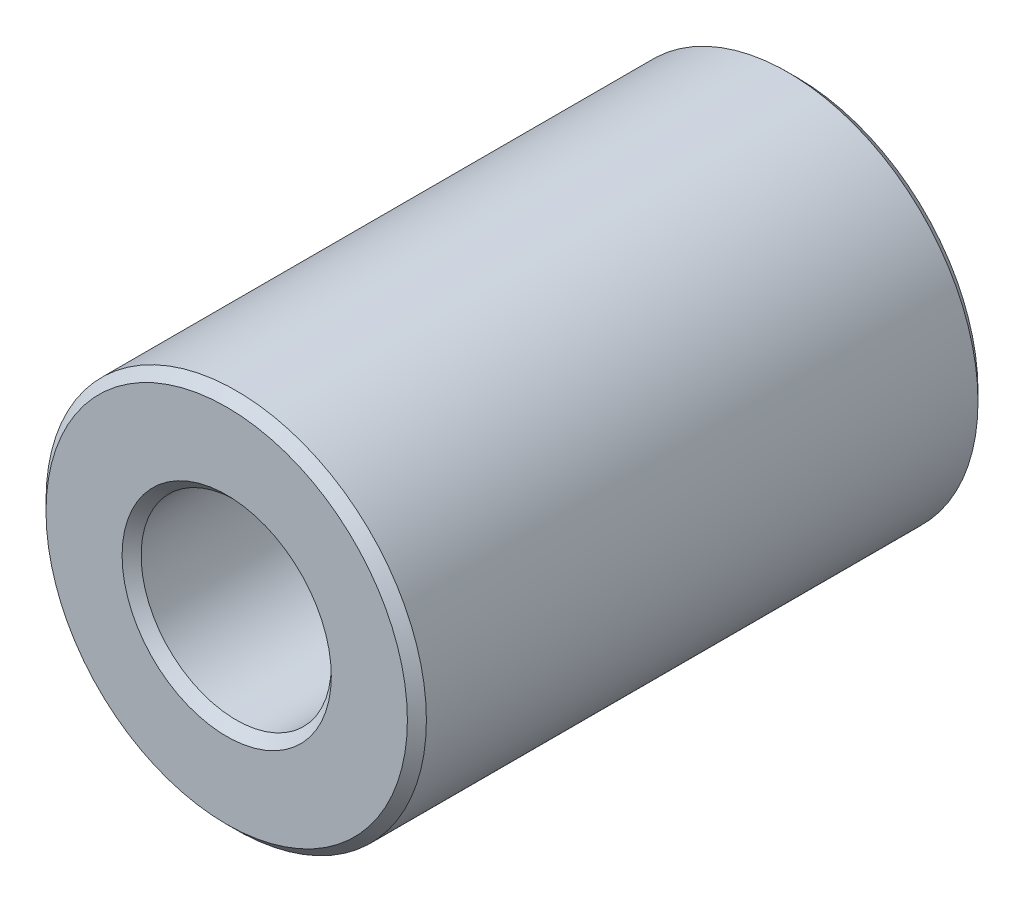
ISO-10303-21;
HEADER;
FILE_DESCRIPTION(('STEP AP214'),'2;1');
FILE_NAME('part.step','',(''),(''),'','','');
FILE_SCHEMA(('AUTOMOTIVE_DESIGN { 1 0 10303 214 1 1 1 1 }'));
ENDSEC;
DATA;
#1=APPLICATION_CONTEXT('core data for automotive mechanical design processes');
#2=APPLICATION_PROTOCOL_DEFINITION('international standard','automotive_design',2000,#1);
#3=PRODUCT_CONTEXT('',#1,'mechanical');
#4=PRODUCT('Part','Part','',(#3));
#5=PRODUCT_RELATED_PRODUCT_CATEGORY('part','',(#4));
#6=PRODUCT_DEFINITION_FORMATION('','',#4);
#7=PRODUCT_DEFINITION_CONTEXT('part definition',#1,'design');
#8=PRODUCT_DEFINITION('design','',#6,#7);
#9=PRODUCT_DEFINITION_SHAPE('','',#8);
#10=(LENGTH_UNIT() NAMED_UNIT(*) SI_UNIT(.MILLI.,.METRE.));
#11=(NAMED_UNIT(*) PLANE_ANGLE_UNIT() SI_UNIT($,.RADIAN.));
#12=(NAMED_UNIT(*) SI_UNIT($,.STERADIAN.) SOLID_ANGLE_UNIT());
#13=UNCERTAINTY_MEASURE_WITH_UNIT(LENGTH_MEASURE(1.E-05),#10,'distance_accuracy_value','');
#14=(GEOMETRIC_REPRESENTATION_CONTEXT(3) GLOBAL_UNCERTAINTY_ASSIGNED_CONTEXT((#13)) GLOBAL_UNIT_ASSIGNED_CONTEXT((#10,
#11,#12)) REPRESENTATION_CONTEXT('',''));
#15=CARTESIAN_POINT('',(0.,0.,0.));
#16=DIRECTION('',(0.,0.,1.));
#17=DIRECTION('',(1.,0.,0.));
#18=AXIS2_PLACEMENT_3D('',#15,#16,#17);
#19=CARTESIAN_POINT('',(0.,0.,6.));
#20=DIRECTION('',(0.,0.,1.));
#21=DIRECTION('',(1.,0.,0.));
#22=AXIS2_PLACEMENT_3D('',#19,#20,#21);
#23=PLANE('',#22);
#24=CARTESIAN_POINT('',(0.,0.,6.));
#25=DIRECTION('',(0.,0.,1.));
#26=DIRECTION('',(1.,0.,0.));
#27=AXIS2_PLACEMENT_3D('',#24,#25,#26);
#28=CIRCLE('',#27,2.2);
#29=CARTESIAN_POINT('',(2.2,0.,6.));
#30=VERTEX_POINT('',#29);
#31=EDGE_CURVE('E54',#30,#30,#28,.F.);
#32=ORIENTED_EDGE('',*,*,#31,.T.);
#33=EDGE_LOOP('',(#32));
#34=FACE_BOUND('',#33,.T.);
#35=CARTESIAN_POINT('',(0.,0.,6.));
#36=DIRECTION('',(0.,0.,1.));
#37=DIRECTION('',(1.,0.,0.));
#38=AXIS2_PLACEMENT_3D('',#35,#36,#37);
#39=CIRCLE('',#38,3.8);
#40=CARTESIAN_POINT('',(3.8,0.,6.));
#41=VERTEX_POINT('',#40);
#42=EDGE_CURVE('E57',#41,#41,#39,.T.);
#43=ORIENTED_EDGE('',*,*,#42,.T.);
#44=EDGE_LOOP('',(#43));
#45=FACE_BOUND('',#44,.T.);
#46=ADVANCED_FACE('F33',(#34,#45),#23,.T.);
#47=CARTESIAN_POINT('',(0.,0.,-6.));
#48=DIRECTION('',(0.,0.,1.));
#49=DIRECTION('',(1.,0.,0.));
#50=AXIS2_PLACEMENT_3D('',#47,#48,#49);
#51=PLANE('',#50);
#52=CARTESIAN_POINT('',(0.,0.,-6.));
#53=DIRECTION('',(0.,0.,1.));
#54=DIRECTION('',(1.,0.,0.));
#55=AXIS2_PLACEMENT_3D('',#52,#53,#54);
#56=CIRCLE('',#55,2.2);
#57=CARTESIAN_POINT('',(2.2,0.,-6.));
#58=VERTEX_POINT('',#57);
#59=EDGE_CURVE('E45',#58,#58,#56,.T.);
#60=ORIENTED_EDGE('',*,*,#59,.T.);
#61=EDGE_LOOP('',(#60));
#62=FACE_BOUND('',#61,.T.);
#63=CARTESIAN_POINT('',(0.,0.,-6.));
#64=DIRECTION('',(0.,0.,1.));
#65=DIRECTION('',(1.,0.,0.));
#66=AXIS2_PLACEMENT_3D('',#63,#64,#65);
#67=CIRCLE('',#66,3.8);
#68=CARTESIAN_POINT('',(3.8,0.,-6.));
#69=VERTEX_POINT('',#68);
#70=EDGE_CURVE('E49',#69,#69,#67,.F.);
#71=ORIENTED_EDGE('',*,*,#70,.T.);
#72=EDGE_LOOP('',(#71));
#73=FACE_BOUND('',#72,.T.);
#74=ADVANCED_FACE('F77',(#62,#73),#51,.F.);
#75=CARTESIAN_POINT('',(0.,0.,6.));
#76=DIRECTION('',(0.,0.,-1.));
#77=DIRECTION('',(-1.,0.,0.));
#78=AXIS2_PLACEMENT_3D('',#75,#76,#77);
#79=CYLINDRICAL_SURFACE('',#78,4.);
#80=CARTESIAN_POINT('',(0.,0.,-5.8));
#81=DIRECTION('',(0.,0.,1.));
#82=DIRECTION('',(1.,0.,0.));
#83=AXIS2_PLACEMENT_3D('',#80,#81,#82);
#84=CIRCLE('',#83,4.);
#85=CARTESIAN_POINT('',(4.,0.,-5.8));
#86=VERTEX_POINT('',#85);
#87=EDGE_CURVE('E10',#86,#86,#84,.T.);
#88=ORIENTED_EDGE('',*,*,#87,.T.);
#89=EDGE_LOOP('',(#88));
#90=FACE_BOUND('',#89,.T.);
#91=CARTESIAN_POINT('',(0.,0.,5.8));
#92=DIRECTION('',(0.,0.,1.));
#93=DIRECTION('',(1.,0.,0.));
#94=AXIS2_PLACEMENT_3D('',#91,#92,#93);
#95=CIRCLE('',#94,4.);
#96=CARTESIAN_POINT('',(4.,0.,5.8));
#97=VERTEX_POINT('',#96);
#98=EDGE_CURVE('E41',#97,#97,#95,.F.);
#99=ORIENTED_EDGE('',*,*,#98,.T.);
#100=EDGE_LOOP('',(#99));
#101=FACE_BOUND('',#100,.T.);
#102=ADVANCED_FACE('F80',(#90,#101),#79,.T.);
#103=CARTESIAN_POINT('',(0.,0.,6.));
#104=DIRECTION('',(0.,0.,-1.));
#105=DIRECTION('',(-1.,0.,0.));
#106=AXIS2_PLACEMENT_3D('',#103,#104,#105);
#107=CYLINDRICAL_SURFACE('',#106,2.);
#108=CARTESIAN_POINT('',(0.,0.,5.8));
#109=DIRECTION('',(0.,0.,1.));
#110=DIRECTION('',(1.,0.,0.));
#111=AXIS2_PLACEMENT_3D('',#108,#109,#110);
#112=CIRCLE('',#111,2.);
#113=CARTESIAN_POINT('',(2.,0.,5.8));
#114=VERTEX_POINT('',#113);
#115=EDGE_CURVE('E60',#114,#114,#112,.T.);
#116=ORIENTED_EDGE('',*,*,#115,.T.);
#117=EDGE_LOOP('',(#116));
#118=FACE_BOUND('',#117,.T.);
#119=CARTESIAN_POINT('',(0.,0.,-5.8));
#120=DIRECTION('',(0.,0.,1.));
#121=DIRECTION('',(1.,0.,0.));
#122=AXIS2_PLACEMENT_3D('',#119,#120,#121);
#123=CIRCLE('',#122,2.);
#124=CARTESIAN_POINT('',(2.,0.,-5.8));
#125=VERTEX_POINT('',#124);
#126=EDGE_CURVE('E63',#125,#125,#123,.F.);
#127=ORIENTED_EDGE('',*,*,#126,.T.);
#128=EDGE_LOOP('',(#127));
#129=FACE_BOUND('',#128,.T.);
#130=ADVANCED_FACE('F67',(#118,#129),#107,.F.);
#131=CARTESIAN_POINT('',(0.,0.,5.8));
#132=DIRECTION('',(0.,0.,1.));
#133=DIRECTION('',(1.,0.,0.));
#134=AXIS2_PLACEMENT_3D('',#131,#132,#133);
#135=CONICAL_SURFACE('',#134,2.,0.785398163397448);
#136=ORIENTED_EDGE('',*,*,#31,.F.);
#137=EDGE_LOOP('',(#136));
#138=FACE_BOUND('',#137,.T.);
#139=ORIENTED_EDGE('',*,*,#115,.F.);
#140=EDGE_LOOP('',(#139));
#141=FACE_BOUND('',#140,.T.);
#142=ADVANCED_FACE('F73',(#138,#141),#135,.F.);
#143=CARTESIAN_POINT('',(0.,0.,-6.));
#144=DIRECTION('',(0.,0.,-1.));
#145=DIRECTION('',(-1.,0.,0.));
#146=AXIS2_PLACEMENT_3D('',#143,#144,#145);
#147=CONICAL_SURFACE('',#146,2.2,0.785398163397448);
#148=ORIENTED_EDGE('',*,*,#126,.F.);
#149=EDGE_LOOP('',(#148));
#150=FACE_BOUND('',#149,.T.);
#151=ORIENTED_EDGE('',*,*,#59,.F.);
#152=EDGE_LOOP('',(#151));
#153=FACE_BOUND('',#152,.T.);
#154=ADVANCED_FACE('F69',(#150,#153),#147,.F.);
#155=CARTESIAN_POINT('',(0.,0.,-5.8));
#156=DIRECTION('',(0.,0.,1.));
#157=DIRECTION('',(1.,0.,0.));
#158=AXIS2_PLACEMENT_3D('',#155,#156,#157);
#159=CONICAL_SURFACE('',#158,4.,0.785398163397448);
#160=ORIENTED_EDGE('',*,*,#70,.F.);
#161=EDGE_LOOP('',(#160));
#162=FACE_BOUND('',#161,.T.);
#163=ORIENTED_EDGE('',*,*,#87,.F.);
#164=EDGE_LOOP('',(#163));
#165=FACE_BOUND('',#164,.T.);
#166=ADVANCED_FACE('F72',(#162,#165),#159,.T.);
#167=CARTESIAN_POINT('',(0.,0.,6.));
#168=DIRECTION('',(0.,0.,-1.));
#169=DIRECTION('',(-1.,0.,0.));
#170=AXIS2_PLACEMENT_3D('',#167,#168,#169);
#171=CONICAL_SURFACE('',#170,3.8,0.78539816339745);
#172=ORIENTED_EDGE('',*,*,#98,.F.);
#173=EDGE_LOOP('',(#172));
#174=FACE_BOUND('',#173,.T.);
#175=ORIENTED_EDGE('',*,*,#42,.F.);
#176=EDGE_LOOP('',(#175));
#177=FACE_BOUND('',#176,.T.);
#178=ADVANCED_FACE('F36',(#174,#177),#171,.T.);
#179=CLOSED_SHELL('',(#46,#74,#102,#130,#142,#154,#166,#178));
#180=MANIFOLD_SOLID_BREP('B2',#179);
#181=ADVANCED_BREP_SHAPE_REPRESENTATION('',(#18,#180),#14);
#182=SHAPE_DEFINITION_REPRESENTATION(#9,#181);
ENDSEC;
END-ISO-10303-21;
